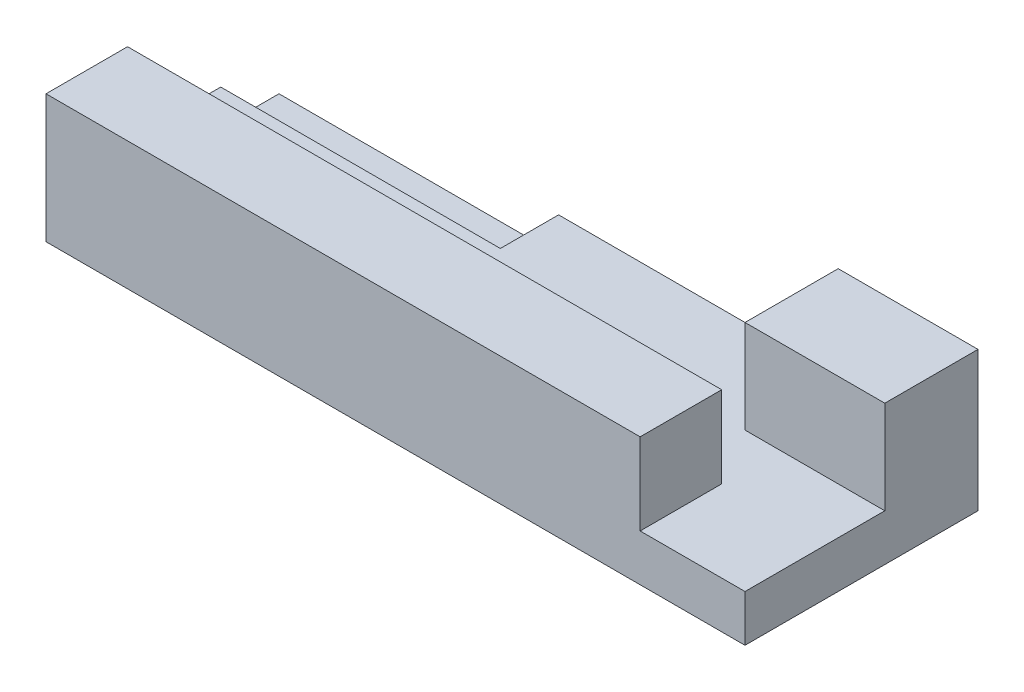
ISO-10303-21;
HEADER;
FILE_DESCRIPTION(('STEP AP214'),'2;1');
FILE_NAME('part.step','',(''),(''),'','','');
FILE_SCHEMA(('AUTOMOTIVE_DESIGN { 1 0 10303 214 1 1 1 1 }'));
ENDSEC;
DATA;
#1=APPLICATION_CONTEXT('core data for automotive mechanical design processes');
#2=APPLICATION_PROTOCOL_DEFINITION('international standard','automotive_design',2000,#1);
#3=PRODUCT_CONTEXT('',#1,'mechanical');
#4=PRODUCT('Part','Part','',(#3));
#5=PRODUCT_RELATED_PRODUCT_CATEGORY('part','',(#4));
#6=PRODUCT_DEFINITION_FORMATION('','',#4);
#7=PRODUCT_DEFINITION_CONTEXT('part definition',#1,'design');
#8=PRODUCT_DEFINITION('design','',#6,#7);
#9=PRODUCT_DEFINITION_SHAPE('','',#8);
#10=(LENGTH_UNIT() NAMED_UNIT(*) SI_UNIT(.MILLI.,.METRE.));
#11=(NAMED_UNIT(*) PLANE_ANGLE_UNIT() SI_UNIT($,.RADIAN.));
#12=(NAMED_UNIT(*) SI_UNIT($,.STERADIAN.) SOLID_ANGLE_UNIT());
#13=UNCERTAINTY_MEASURE_WITH_UNIT(LENGTH_MEASURE(1.E-05),#10,'distance_accuracy_value','');
#14=(GEOMETRIC_REPRESENTATION_CONTEXT(3) GLOBAL_UNCERTAINTY_ASSIGNED_CONTEXT((#13)) GLOBAL_UNIT_ASSIGNED_CONTEXT((#10,
#11,#12)) REPRESENTATION_CONTEXT('',''));
#15=CARTESIAN_POINT('',(0.,0.,0.));
#16=DIRECTION('',(0.,0.,1.));
#17=DIRECTION('',(1.,0.,0.));
#18=AXIS2_PLACEMENT_3D('',#15,#16,#17);
#19=CARTESIAN_POINT('',(-150.,20.,0.));
#20=DIRECTION('',(-1.,0.,0.));
#21=DIRECTION('',(0.,0.,1.));
#22=AXIS2_PLACEMENT_3D('',#19,#20,#21);
#23=PLANE('',#22);
#24=DIRECTION('',(0.,0.,-1.));
#25=VECTOR('',#24,1.);
#26=CARTESIAN_POINT('',(-150.,20.,0.));
#27=LINE('',#26,#25);
#28=CARTESIAN_POINT('',(-150.,20.,15.));
#29=VERTEX_POINT('',#28);
#30=CARTESIAN_POINT('',(-150.,20.,-25.));
#31=VERTEX_POINT('',#30);
#32=EDGE_CURVE('E237',#29,#31,#27,.T.);
#33=ORIENTED_EDGE('',*,*,#32,.T.);
#34=DIRECTION('',(0.,1.,0.));
#35=VECTOR('',#34,1.);
#36=CARTESIAN_POINT('',(-150.,5.,-25.));
#37=LINE('',#36,#35);
#38=CARTESIAN_POINT('',(-150.,5.,-25.));
#39=VERTEX_POINT('',#38);
#40=EDGE_CURVE('E181',#39,#31,#37,.T.);
#41=ORIENTED_EDGE('',*,*,#40,.F.);
#42=DIRECTION('',(0.,0.,-1.));
#43=VECTOR('',#42,1.);
#44=CARTESIAN_POINT('',(-150.,5.,0.));
#45=LINE('',#44,#43);
#46=CARTESIAN_POINT('',(-150.,5.,-50.));
#47=VERTEX_POINT('',#46);
#48=EDGE_CURVE('E169',#39,#47,#45,.T.);
#49=ORIENTED_EDGE('',*,*,#48,.T.);
#50=DIRECTION('',(0.,-1.,0.));
#51=VECTOR('',#50,1.);
#52=CARTESIAN_POINT('',(-150.,20.,-50.));
#53=LINE('',#52,#51);
#54=CARTESIAN_POINT('',(-150.,0.,-50.));
#55=VERTEX_POINT('',#54);
#56=EDGE_CURVE('E179',#47,#55,#53,.T.);
#57=ORIENTED_EDGE('',*,*,#56,.T.);
#58=DIRECTION('',(0.,0.,-1.));
#59=VECTOR('',#58,1.);
#60=CARTESIAN_POINT('',(-150.,0.,0.));
#61=LINE('',#60,#59);
#62=CARTESIAN_POINT('',(-150.,0.,50.));
#63=VERTEX_POINT('',#62);
#64=EDGE_CURVE('E193',#63,#55,#61,.T.);
#65=ORIENTED_EDGE('',*,*,#64,.F.);
#66=DIRECTION('',(0.,-1.,0.));
#67=VECTOR('',#66,1.);
#68=CARTESIAN_POINT('',(-150.,20.,50.));
#69=LINE('',#68,#67);
#70=CARTESIAN_POINT('',(-150.,55.,50.));
#71=VERTEX_POINT('',#70);
#72=EDGE_CURVE('E198',#71,#63,#69,.T.);
#73=ORIENTED_EDGE('',*,*,#72,.F.);
#74=DIRECTION('',(0.,0.,-1.));
#75=VECTOR('',#74,1.);
#76=CARTESIAN_POINT('',(-150.,55.,50.));
#77=LINE('',#76,#75);
#78=CARTESIAN_POINT('',(-150.,55.,15.));
#79=VERTEX_POINT('',#78);
#80=EDGE_CURVE('E247',#71,#79,#77,.T.);
#81=ORIENTED_EDGE('',*,*,#80,.T.);
#82=DIRECTION('',(0.,-1.,0.));
#83=VECTOR('',#82,1.);
#84=CARTESIAN_POINT('',(-150.,55.,15.));
#85=LINE('',#84,#83);
#86=EDGE_CURVE('E244',#79,#29,#85,.T.);
#87=ORIENTED_EDGE('',*,*,#86,.T.);
#88=EDGE_LOOP('',(#33,#41,#49,#57,#65,#73,#81,#87));
#89=FACE_BOUND('',#88,.T.);
#90=ADVANCED_FACE('F69',(#89),#23,.T.);
#91=CARTESIAN_POINT('',(0.,20.,0.));
#92=DIRECTION('',(0.,1.,0.));
#93=DIRECTION('',(0.,0.,1.));
#94=AXIS2_PLACEMENT_3D('',#91,#92,#93);
#95=PLANE('',#94);
#96=DIRECTION('',(0.,0.,-1.));
#97=VECTOR('',#96,1.);
#98=CARTESIAN_POINT('',(-30.,20.,0.));
#99=LINE('',#98,#97);
#100=CARTESIAN_POINT('',(-30.,20.,-25.));
#101=VERTEX_POINT('',#100);
#102=CARTESIAN_POINT('',(-30.,20.,-50.));
#103=VERTEX_POINT('',#102);
#104=EDGE_CURVE('E305',#101,#103,#99,.T.);
#105=ORIENTED_EDGE('',*,*,#104,.F.);
#106=DIRECTION('',(-1.,0.,0.));
#107=VECTOR('',#106,1.);
#108=CARTESIAN_POINT('',(0.,20.,-25.));
#109=LINE('',#108,#107);
#110=EDGE_CURVE('E183',#101,#31,#109,.T.);
#111=ORIENTED_EDGE('',*,*,#110,.T.);
#112=ORIENTED_EDGE('',*,*,#32,.F.);
#113=DIRECTION('',(-1.,0.,0.));
#114=VECTOR('',#113,1.);
#115=CARTESIAN_POINT('',(0.,20.,15.));
#116=LINE('',#115,#114);
#117=CARTESIAN_POINT('',(105.,20.,15.));
#118=VERTEX_POINT('',#117);
#119=EDGE_CURVE('E78',#118,#29,#116,.T.);
#120=ORIENTED_EDGE('',*,*,#119,.F.);
#121=DIRECTION('',(0.,0.,1.));
#122=VECTOR('',#121,1.);
#123=CARTESIAN_POINT('',(105.,20.,0.));
#124=LINE('',#123,#122);
#125=CARTESIAN_POINT('',(105.,20.,50.));
#126=VERTEX_POINT('',#125);
#127=EDGE_CURVE('E12',#118,#126,#124,.T.);
#128=ORIENTED_EDGE('',*,*,#127,.T.);
#129=DIRECTION('',(1.,0.,0.));
#130=VECTOR('',#129,1.);
#131=CARTESIAN_POINT('',(0.,20.,50.));
#132=LINE('',#131,#130);
#133=CARTESIAN_POINT('',(150.,20.,50.));
#134=VERTEX_POINT('',#133);
#135=EDGE_CURVE('E234',#126,#134,#132,.T.);
#136=ORIENTED_EDGE('',*,*,#135,.T.);
#137=DIRECTION('',(0.,0.,-1.));
#138=VECTOR('',#137,1.);
#139=CARTESIAN_POINT('',(150.,20.,0.));
#140=LINE('',#139,#138);
#141=CARTESIAN_POINT('',(150.,20.,-10.));
#142=VERTEX_POINT('',#141);
#143=EDGE_CURVE('E220',#134,#142,#140,.T.);
#144=ORIENTED_EDGE('',*,*,#143,.T.);
#145=DIRECTION('',(1.,0.,0.));
#146=VECTOR('',#145,1.);
#147=CARTESIAN_POINT('',(0.,20.,-10.));
#148=LINE('',#147,#146);
#149=CARTESIAN_POINT('',(90.,20.,-10.));
#150=VERTEX_POINT('',#149);
#151=EDGE_CURVE('E93',#150,#142,#148,.T.);
#152=ORIENTED_EDGE('',*,*,#151,.F.);
#153=DIRECTION('',(0.,0.,-1.));
#154=VECTOR('',#153,1.);
#155=CARTESIAN_POINT('',(90.,20.,0.));
#156=LINE('',#155,#154);
#157=CARTESIAN_POINT('',(90.,20.,-50.));
#158=VERTEX_POINT('',#157);
#159=EDGE_CURVE('E262',#150,#158,#156,.T.);
#160=ORIENTED_EDGE('',*,*,#159,.T.);
#161=DIRECTION('',(1.,0.,0.));
#162=VECTOR('',#161,1.);
#163=CARTESIAN_POINT('',(0.,20.,-50.));
#164=LINE('',#163,#162);
#165=EDGE_CURVE('E226',#103,#158,#164,.T.);
#166=ORIENTED_EDGE('',*,*,#165,.F.);
#167=EDGE_LOOP('',(#105,#111,#112,#120,#128,#136,#144,#152,#160,#166));
#168=FACE_BOUND('',#167,.T.);
#169=ADVANCED_FACE('F319',(#168),#95,.T.);
#170=CARTESIAN_POINT('',(0.,20.,50.));
#171=DIRECTION('',(0.,0.,-1.));
#172=DIRECTION('',(-1.,0.,0.));
#173=AXIS2_PLACEMENT_3D('',#170,#171,#172);
#174=PLANE('',#173);
#175=DIRECTION('',(1.,0.,0.));
#176=VECTOR('',#175,1.);
#177=CARTESIAN_POINT('',(0.,0.,50.));
#178=LINE('',#177,#176);
#179=CARTESIAN_POINT('',(150.,0.,50.));
#180=VERTEX_POINT('',#179);
#181=EDGE_CURVE('E227',#63,#180,#178,.T.);
#182=ORIENTED_EDGE('',*,*,#181,.T.);
#183=DIRECTION('',(0.,-1.,0.));
#184=VECTOR('',#183,1.);
#185=CARTESIAN_POINT('',(150.,20.,50.));
#186=LINE('',#185,#184);
#187=EDGE_CURVE('E207',#134,#180,#186,.T.);
#188=ORIENTED_EDGE('',*,*,#187,.F.);
#189=ORIENTED_EDGE('',*,*,#135,.F.);
#190=DIRECTION('',(0.,-1.,0.));
#191=VECTOR('',#190,1.);
#192=CARTESIAN_POINT('',(105.,55.,50.));
#193=LINE('',#192,#191);
#194=CARTESIAN_POINT('',(105.,55.,50.));
#195=VERTEX_POINT('',#194);
#196=EDGE_CURVE('E189',#195,#126,#193,.T.);
#197=ORIENTED_EDGE('',*,*,#196,.F.);
#198=DIRECTION('',(1.,0.,0.));
#199=VECTOR('',#198,1.);
#200=CARTESIAN_POINT('',(-150.,55.,50.));
#201=LINE('',#200,#199);
#202=EDGE_CURVE('E258',#71,#195,#201,.T.);
#203=ORIENTED_EDGE('',*,*,#202,.F.);
#204=ORIENTED_EDGE('',*,*,#72,.T.);
#205=EDGE_LOOP('',(#182,#188,#189,#197,#203,#204));
#206=FACE_BOUND('',#205,.T.);
#207=ADVANCED_FACE('F334',(#206),#174,.F.);
#208=CARTESIAN_POINT('',(150.,20.,0.));
#209=DIRECTION('',(-1.,0.,0.));
#210=DIRECTION('',(0.,0.,1.));
#211=AXIS2_PLACEMENT_3D('',#208,#209,#210);
#212=PLANE('',#211);
#213=DIRECTION('',(0.,0.,-1.));
#214=VECTOR('',#213,1.);
#215=CARTESIAN_POINT('',(150.,0.,0.));
#216=LINE('',#215,#214);
#217=CARTESIAN_POINT('',(150.,0.,-50.));
#218=VERTEX_POINT('',#217);
#219=EDGE_CURVE('E223',#180,#218,#216,.T.);
#220=ORIENTED_EDGE('',*,*,#219,.T.);
#221=DIRECTION('',(0.,-1.,0.));
#222=VECTOR('',#221,1.);
#223=CARTESIAN_POINT('',(150.,20.,-50.));
#224=LINE('',#223,#222);
#225=CARTESIAN_POINT('',(150.,60.,-50.));
#226=VERTEX_POINT('',#225);
#227=EDGE_CURVE('E213',#226,#218,#224,.T.);
#228=ORIENTED_EDGE('',*,*,#227,.F.);
#229=DIRECTION('',(0.,0.,1.));
#230=VECTOR('',#229,1.);
#231=CARTESIAN_POINT('',(150.,60.,-50.));
#232=LINE('',#231,#230);
#233=CARTESIAN_POINT('',(150.,60.,-10.));
#234=VERTEX_POINT('',#233);
#235=EDGE_CURVE('E289',#226,#234,#232,.T.);
#236=ORIENTED_EDGE('',*,*,#235,.T.);
#237=DIRECTION('',(0.,-1.,0.));
#238=VECTOR('',#237,1.);
#239=CARTESIAN_POINT('',(150.,60.,-10.));
#240=LINE('',#239,#238);
#241=EDGE_CURVE('E268',#234,#142,#240,.T.);
#242=ORIENTED_EDGE('',*,*,#241,.T.);
#243=ORIENTED_EDGE('',*,*,#143,.F.);
#244=ORIENTED_EDGE('',*,*,#187,.T.);
#245=EDGE_LOOP('',(#220,#228,#236,#242,#243,#244));
#246=FACE_BOUND('',#245,.T.);
#247=ADVANCED_FACE('F329',(#246),#212,.F.);
#248=CARTESIAN_POINT('',(0.,20.,-50.));
#249=DIRECTION('',(0.,0.,-1.));
#250=DIRECTION('',(-1.,0.,0.));
#251=AXIS2_PLACEMENT_3D('',#248,#249,#250);
#252=PLANE('',#251);
#253=DIRECTION('',(0.,1.,0.));
#254=VECTOR('',#253,1.);
#255=CARTESIAN_POINT('',(-30.,5.,-50.));
#256=LINE('',#255,#254);
#257=CARTESIAN_POINT('',(-30.,5.,-50.));
#258=VERTEX_POINT('',#257);
#259=EDGE_CURVE('E293',#258,#103,#256,.T.);
#260=ORIENTED_EDGE('',*,*,#259,.T.);
#261=ORIENTED_EDGE('',*,*,#165,.T.);
#262=DIRECTION('',(0.,-1.,0.));
#263=VECTOR('',#262,1.);
#264=CARTESIAN_POINT('',(90.,60.,-50.));
#265=LINE('',#264,#263);
#266=CARTESIAN_POINT('',(90.,60.,-50.));
#267=VERTEX_POINT('',#266);
#268=EDGE_CURVE('E267',#267,#158,#265,.T.);
#269=ORIENTED_EDGE('',*,*,#268,.F.);
#270=DIRECTION('',(-1.,0.,0.));
#271=VECTOR('',#270,1.);
#272=CARTESIAN_POINT('',(150.,60.,-50.));
#273=LINE('',#272,#271);
#274=EDGE_CURVE('E273',#226,#267,#273,.T.);
#275=ORIENTED_EDGE('',*,*,#274,.F.);
#276=ORIENTED_EDGE('',*,*,#227,.T.);
#277=DIRECTION('',(1.,0.,0.));
#278=VECTOR('',#277,1.);
#279=CARTESIAN_POINT('',(0.,0.,-50.));
#280=LINE('',#279,#278);
#281=EDGE_CURVE('E187',#55,#218,#280,.T.);
#282=ORIENTED_EDGE('',*,*,#281,.F.);
#283=ORIENTED_EDGE('',*,*,#56,.F.);
#284=DIRECTION('',(-1.,0.,0.));
#285=VECTOR('',#284,1.);
#286=CARTESIAN_POINT('',(0.,5.,-50.));
#287=LINE('',#286,#285);
#288=EDGE_CURVE('E166',#258,#47,#287,.T.);
#289=ORIENTED_EDGE('',*,*,#288,.F.);
#290=EDGE_LOOP('',(#260,#261,#269,#275,#276,#282,#283,#289));
#291=FACE_BOUND('',#290,.T.);
#292=ADVANCED_FACE('F71',(#291),#252,.T.);
#293=CARTESIAN_POINT('',(0.,0.,0.));
#294=DIRECTION('',(0.,1.,0.));
#295=DIRECTION('',(0.,0.,1.));
#296=AXIS2_PLACEMENT_3D('',#293,#294,#295);
#297=PLANE('',#296);
#298=ORIENTED_EDGE('',*,*,#281,.T.);
#299=ORIENTED_EDGE('',*,*,#219,.F.);
#300=ORIENTED_EDGE('',*,*,#181,.F.);
#301=ORIENTED_EDGE('',*,*,#64,.T.);
#302=EDGE_LOOP('',(#298,#299,#300,#301));
#303=FACE_BOUND('',#302,.T.);
#304=ADVANCED_FACE('F331',(#303),#297,.F.);
#305=CARTESIAN_POINT('',(105.,55.,50.));
#306=DIRECTION('',(-1.,0.,0.));
#307=DIRECTION('',(0.,0.,1.));
#308=AXIS2_PLACEMENT_3D('',#305,#306,#307);
#309=PLANE('',#308);
#310=ORIENTED_EDGE('',*,*,#127,.F.);
#311=DIRECTION('',(0.,-1.,0.));
#312=VECTOR('',#311,1.);
#313=CARTESIAN_POINT('',(105.,55.,15.));
#314=LINE('',#313,#312);
#315=CARTESIAN_POINT('',(105.,55.,15.));
#316=VERTEX_POINT('',#315);
#317=EDGE_CURVE('E195',#316,#118,#314,.T.);
#318=ORIENTED_EDGE('',*,*,#317,.F.);
#319=DIRECTION('',(0.,0.,-1.));
#320=VECTOR('',#319,1.);
#321=CARTESIAN_POINT('',(105.,55.,50.));
#322=LINE('',#321,#320);
#323=EDGE_CURVE('E255',#195,#316,#322,.T.);
#324=ORIENTED_EDGE('',*,*,#323,.F.);
#325=ORIENTED_EDGE('',*,*,#196,.T.);
#326=EDGE_LOOP('',(#310,#318,#324,#325));
#327=FACE_BOUND('',#326,.T.);
#328=ADVANCED_FACE('F364',(#327),#309,.F.);
#329=CARTESIAN_POINT('',(-150.,55.,15.));
#330=DIRECTION('',(0.,0.,-1.));
#331=DIRECTION('',(-1.,0.,0.));
#332=AXIS2_PLACEMENT_3D('',#329,#330,#331);
#333=PLANE('',#332);
#334=ORIENTED_EDGE('',*,*,#317,.T.);
#335=ORIENTED_EDGE('',*,*,#119,.T.);
#336=ORIENTED_EDGE('',*,*,#86,.F.);
#337=DIRECTION('',(1.,0.,0.));
#338=VECTOR('',#337,1.);
#339=CARTESIAN_POINT('',(-150.,55.,15.));
#340=LINE('',#339,#338);
#341=EDGE_CURVE('E251',#79,#316,#340,.T.);
#342=ORIENTED_EDGE('',*,*,#341,.T.);
#343=EDGE_LOOP('',(#334,#335,#336,#342));
#344=FACE_BOUND('',#343,.T.);
#345=ADVANCED_FACE('F340',(#344),#333,.T.);
#346=CARTESIAN_POINT('',(0.,55.,0.));
#347=DIRECTION('',(0.,1.,0.));
#348=DIRECTION('',(0.,0.,1.));
#349=AXIS2_PLACEMENT_3D('',#346,#347,#348);
#350=PLANE('',#349);
#351=ORIENTED_EDGE('',*,*,#202,.T.);
#352=ORIENTED_EDGE('',*,*,#323,.T.);
#353=ORIENTED_EDGE('',*,*,#341,.F.);
#354=ORIENTED_EDGE('',*,*,#80,.F.);
#355=EDGE_LOOP('',(#351,#352,#353,#354));
#356=FACE_BOUND('',#355,.T.);
#357=ADVANCED_FACE('F338',(#356),#350,.T.);
#358=CARTESIAN_POINT('',(90.,60.,-50.));
#359=DIRECTION('',(1.,0.,0.));
#360=DIRECTION('',(0.,0.,-1.));
#361=AXIS2_PLACEMENT_3D('',#358,#359,#360);
#362=PLANE('',#361);
#363=ORIENTED_EDGE('',*,*,#159,.F.);
#364=DIRECTION('',(0.,-1.,0.));
#365=VECTOR('',#364,1.);
#366=CARTESIAN_POINT('',(90.,60.,-10.));
#367=LINE('',#366,#365);
#368=CARTESIAN_POINT('',(90.,60.,-10.));
#369=VERTEX_POINT('',#368);
#370=EDGE_CURVE('E272',#369,#150,#367,.T.);
#371=ORIENTED_EDGE('',*,*,#370,.F.);
#372=DIRECTION('',(0.,0.,1.));
#373=VECTOR('',#372,1.);
#374=CARTESIAN_POINT('',(90.,60.,-50.));
#375=LINE('',#374,#373);
#376=EDGE_CURVE('E282',#267,#369,#375,.T.);
#377=ORIENTED_EDGE('',*,*,#376,.F.);
#378=ORIENTED_EDGE('',*,*,#268,.T.);
#379=EDGE_LOOP('',(#363,#371,#377,#378));
#380=FACE_BOUND('',#379,.T.);
#381=ADVANCED_FACE('F323',(#380),#362,.F.);
#382=CARTESIAN_POINT('',(150.,60.,-10.));
#383=DIRECTION('',(0.,0.,1.));
#384=DIRECTION('',(1.,0.,0.));
#385=AXIS2_PLACEMENT_3D('',#382,#383,#384);
#386=PLANE('',#385);
#387=ORIENTED_EDGE('',*,*,#370,.T.);
#388=ORIENTED_EDGE('',*,*,#151,.T.);
#389=ORIENTED_EDGE('',*,*,#241,.F.);
#390=DIRECTION('',(-1.,0.,0.));
#391=VECTOR('',#390,1.);
#392=CARTESIAN_POINT('',(150.,60.,-10.));
#393=LINE('',#392,#391);
#394=EDGE_CURVE('E285',#234,#369,#393,.T.);
#395=ORIENTED_EDGE('',*,*,#394,.T.);
#396=EDGE_LOOP('',(#387,#388,#389,#395));
#397=FACE_BOUND('',#396,.T.);
#398=ADVANCED_FACE('F343',(#397),#386,.T.);
#399=CARTESIAN_POINT('',(0.,60.,0.));
#400=DIRECTION('',(0.,-1.,0.));
#401=DIRECTION('',(0.,0.,-1.));
#402=AXIS2_PLACEMENT_3D('',#399,#400,#401);
#403=PLANE('',#402);
#404=ORIENTED_EDGE('',*,*,#235,.F.);
#405=ORIENTED_EDGE('',*,*,#274,.T.);
#406=ORIENTED_EDGE('',*,*,#376,.T.);
#407=ORIENTED_EDGE('',*,*,#394,.F.);
#408=EDGE_LOOP('',(#404,#405,#406,#407));
#409=FACE_BOUND('',#408,.T.);
#410=ADVANCED_FACE('F328',(#409),#403,.F.);
#411=CARTESIAN_POINT('',(-30.,5.,0.));
#412=DIRECTION('',(1.,0.,0.));
#413=DIRECTION('',(0.,0.,-1.));
#414=AXIS2_PLACEMENT_3D('',#411,#412,#413);
#415=PLANE('',#414);
#416=ORIENTED_EDGE('',*,*,#104,.T.);
#417=ORIENTED_EDGE('',*,*,#259,.F.);
#418=DIRECTION('',(0.,0.,-1.));
#419=VECTOR('',#418,1.);
#420=CARTESIAN_POINT('',(-30.,5.,0.));
#421=LINE('',#420,#419);
#422=CARTESIAN_POINT('',(-30.,5.,-25.));
#423=VERTEX_POINT('',#422);
#424=EDGE_CURVE('E85',#423,#258,#421,.T.);
#425=ORIENTED_EDGE('',*,*,#424,.F.);
#426=DIRECTION('',(0.,1.,0.));
#427=VECTOR('',#426,1.);
#428=CARTESIAN_POINT('',(-30.,5.,-25.));
#429=LINE('',#428,#427);
#430=EDGE_CURVE('E296',#423,#101,#429,.T.);
#431=ORIENTED_EDGE('',*,*,#430,.T.);
#432=EDGE_LOOP('',(#416,#417,#425,#431));
#433=FACE_BOUND('',#432,.T.);
#434=ADVANCED_FACE('F315',(#433),#415,.F.);
#435=CARTESIAN_POINT('',(0.,5.,-25.));
#436=DIRECTION('',(0.,0.,-1.));
#437=DIRECTION('',(-1.,0.,0.));
#438=AXIS2_PLACEMENT_3D('',#435,#436,#437);
#439=PLANE('',#438);
#440=ORIENTED_EDGE('',*,*,#110,.F.);
#441=ORIENTED_EDGE('',*,*,#430,.F.);
#442=DIRECTION('',(-1.,0.,0.));
#443=VECTOR('',#442,1.);
#444=CARTESIAN_POINT('',(0.,5.,-25.));
#445=LINE('',#444,#443);
#446=EDGE_CURVE('E301',#423,#39,#445,.T.);
#447=ORIENTED_EDGE('',*,*,#446,.T.);
#448=ORIENTED_EDGE('',*,*,#40,.T.);
#449=EDGE_LOOP('',(#440,#441,#447,#448));
#450=FACE_BOUND('',#449,.T.);
#451=ADVANCED_FACE('F313',(#450),#439,.T.);
#452=CARTESIAN_POINT('',(0.,5.,0.));
#453=DIRECTION('',(0.,1.,0.));
#454=DIRECTION('',(0.,0.,1.));
#455=AXIS2_PLACEMENT_3D('',#452,#453,#454);
#456=PLANE('',#455);
#457=ORIENTED_EDGE('',*,*,#48,.F.);
#458=ORIENTED_EDGE('',*,*,#446,.F.);
#459=ORIENTED_EDGE('',*,*,#424,.T.);
#460=ORIENTED_EDGE('',*,*,#288,.T.);
#461=EDGE_LOOP('',(#457,#458,#459,#460));
#462=FACE_BOUND('',#461,.T.);
#463=ADVANCED_FACE('F168',(#462),#456,.T.);
#464=CLOSED_SHELL('',(#90,#169,#207,#247,#292,#304,#328,#345,#357,#381,#398,#410,#434,#451,#463));
#465=MANIFOLD_SOLID_BREP('B2',#464);
#466=ADVANCED_BREP_SHAPE_REPRESENTATION('',(#18,#465),#14);
#467=SHAPE_DEFINITION_REPRESENTATION(#9,#466);
ENDSEC;
END-ISO-10303-21;
